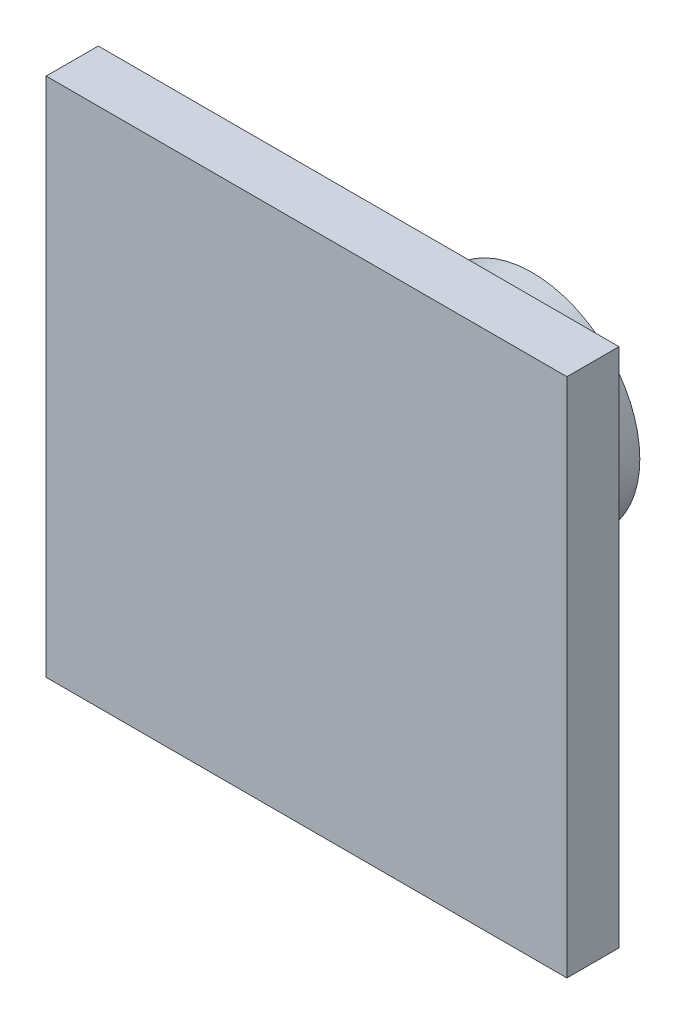
ISO-10303-21;
HEADER;
FILE_DESCRIPTION(('STEP AP214'),'2;1');
FILE_NAME('part.step','',(''),(''),'','','');
FILE_SCHEMA(('AUTOMOTIVE_DESIGN { 1 0 10303 214 1 1 1 1 }'));
ENDSEC;
DATA;
#1=APPLICATION_CONTEXT('core data for automotive mechanical design processes');
#2=APPLICATION_PROTOCOL_DEFINITION('international standard','automotive_design',2000,#1);
#3=PRODUCT_CONTEXT('',#1,'mechanical');
#4=PRODUCT('Part','Part','',(#3));
#5=PRODUCT_RELATED_PRODUCT_CATEGORY('part','',(#4));
#6=PRODUCT_DEFINITION_FORMATION('','',#4);
#7=PRODUCT_DEFINITION_CONTEXT('part definition',#1,'design');
#8=PRODUCT_DEFINITION('design','',#6,#7);
#9=PRODUCT_DEFINITION_SHAPE('','',#8);
#10=(LENGTH_UNIT() NAMED_UNIT(*) SI_UNIT(.MILLI.,.METRE.));
#11=(NAMED_UNIT(*) PLANE_ANGLE_UNIT() SI_UNIT($,.RADIAN.));
#12=(NAMED_UNIT(*) SI_UNIT($,.STERADIAN.) SOLID_ANGLE_UNIT());
#13=UNCERTAINTY_MEASURE_WITH_UNIT(LENGTH_MEASURE(1.E-05),#10,'distance_accuracy_value','');
#14=(GEOMETRIC_REPRESENTATION_CONTEXT(3) GLOBAL_UNCERTAINTY_ASSIGNED_CONTEXT((#13)) GLOBAL_UNIT_ASSIGNED_CONTEXT((#10,
#11,#12)) REPRESENTATION_CONTEXT('',''));
#15=CARTESIAN_POINT('',(0.,0.,0.));
#16=DIRECTION('',(0.,0.,1.));
#17=DIRECTION('',(1.,0.,0.));
#18=AXIS2_PLACEMENT_3D('',#15,#16,#17);
#19=CARTESIAN_POINT('',(7.5,-7.5,1.5));
#20=DIRECTION('',(-1.,0.,0.));
#21=DIRECTION('',(0.,0.,1.));
#22=AXIS2_PLACEMENT_3D('',#19,#20,#21);
#23=PLANE('',#22);
#24=DIRECTION('',(0.,1.,0.));
#25=VECTOR('',#24,1.);
#26=CARTESIAN_POINT('',(7.5,-7.5,0.));
#27=LINE('',#26,#25);
#28=CARTESIAN_POINT('',(7.5,-7.5,0.));
#29=VERTEX_POINT('',#28);
#30=CARTESIAN_POINT('',(7.5,7.5,0.));
#31=VERTEX_POINT('',#30);
#32=EDGE_CURVE('E103',#29,#31,#27,.T.);
#33=ORIENTED_EDGE('',*,*,#32,.T.);
#34=DIRECTION('',(0.,0.,-1.));
#35=VECTOR('',#34,1.);
#36=CARTESIAN_POINT('',(7.5,7.5,1.5));
#37=LINE('',#36,#35);
#38=CARTESIAN_POINT('',(7.5,7.5,1.5));
#39=VERTEX_POINT('',#38);
#40=EDGE_CURVE('E94',#39,#31,#37,.T.);
#41=ORIENTED_EDGE('',*,*,#40,.F.);
#42=DIRECTION('',(0.,1.,0.));
#43=VECTOR('',#42,1.);
#44=CARTESIAN_POINT('',(7.5,-7.5,1.5));
#45=LINE('',#44,#43);
#46=CARTESIAN_POINT('',(7.5,-7.5,1.5));
#47=VERTEX_POINT('',#46);
#48=EDGE_CURVE('E88',#47,#39,#45,.T.);
#49=ORIENTED_EDGE('',*,*,#48,.F.);
#50=DIRECTION('',(0.,0.,-1.));
#51=VECTOR('',#50,1.);
#52=CARTESIAN_POINT('',(7.5,-7.5,1.5));
#53=LINE('',#52,#51);
#54=EDGE_CURVE('E99',#47,#29,#53,.T.);
#55=ORIENTED_EDGE('',*,*,#54,.T.);
#56=EDGE_LOOP('',(#33,#41,#49,#55));
#57=FACE_BOUND('',#56,.T.);
#58=ADVANCED_FACE('F35',(#57),#23,.F.);
#59=CARTESIAN_POINT('',(-7.5,7.5,1.5));
#60=DIRECTION('',(0.,-1.,0.));
#61=DIRECTION('',(0.,0.,-1.));
#62=AXIS2_PLACEMENT_3D('',#59,#60,#61);
#63=PLANE('',#62);
#64=DIRECTION('',(-1.,0.,0.));
#65=VECTOR('',#64,1.);
#66=CARTESIAN_POINT('',(-7.5,7.5,0.));
#67=LINE('',#66,#65);
#68=CARTESIAN_POINT('',(-7.5,7.5,0.));
#69=VERTEX_POINT('',#68);
#70=EDGE_CURVE('E93',#31,#69,#67,.T.);
#71=ORIENTED_EDGE('',*,*,#70,.T.);
#72=DIRECTION('',(0.,0.,-1.));
#73=VECTOR('',#72,1.);
#74=CARTESIAN_POINT('',(-7.5,7.5,1.5));
#75=LINE('',#74,#73);
#76=CARTESIAN_POINT('',(-7.5,7.5,1.5));
#77=VERTEX_POINT('',#76);
#78=EDGE_CURVE('E91',#77,#69,#75,.T.);
#79=ORIENTED_EDGE('',*,*,#78,.F.);
#80=DIRECTION('',(-1.,0.,0.));
#81=VECTOR('',#80,1.);
#82=CARTESIAN_POINT('',(-7.5,7.5,1.5));
#83=LINE('',#82,#81);
#84=EDGE_CURVE('E83',#39,#77,#83,.T.);
#85=ORIENTED_EDGE('',*,*,#84,.F.);
#86=ORIENTED_EDGE('',*,*,#40,.T.);
#87=EDGE_LOOP('',(#71,#79,#85,#86));
#88=FACE_BOUND('',#87,.T.);
#89=ADVANCED_FACE('F92',(#88),#63,.F.);
#90=CARTESIAN_POINT('',(-7.5,-7.5,1.5));
#91=DIRECTION('',(1.,0.,0.));
#92=DIRECTION('',(0.,0.,-1.));
#93=AXIS2_PLACEMENT_3D('',#90,#91,#92);
#94=PLANE('',#93);
#95=DIRECTION('',(0.,-1.,0.));
#96=VECTOR('',#95,1.);
#97=CARTESIAN_POINT('',(-7.5,-7.5,0.));
#98=LINE('',#97,#96);
#99=CARTESIAN_POINT('',(-7.5,-7.5,0.));
#100=VERTEX_POINT('',#99);
#101=EDGE_CURVE('E69',#69,#100,#98,.T.);
#102=ORIENTED_EDGE('',*,*,#101,.T.);
#103=DIRECTION('',(0.,0.,-1.));
#104=VECTOR('',#103,1.);
#105=CARTESIAN_POINT('',(-7.5,-7.5,1.5));
#106=LINE('',#105,#104);
#107=CARTESIAN_POINT('',(-7.5,-7.5,1.5));
#108=VERTEX_POINT('',#107);
#109=EDGE_CURVE('E95',#108,#100,#106,.T.);
#110=ORIENTED_EDGE('',*,*,#109,.F.);
#111=DIRECTION('',(0.,-1.,0.));
#112=VECTOR('',#111,1.);
#113=CARTESIAN_POINT('',(-7.5,-7.5,1.5));
#114=LINE('',#113,#112);
#115=EDGE_CURVE('E86',#77,#108,#114,.T.);
#116=ORIENTED_EDGE('',*,*,#115,.F.);
#117=ORIENTED_EDGE('',*,*,#78,.T.);
#118=EDGE_LOOP('',(#102,#110,#116,#117));
#119=FACE_BOUND('',#118,.T.);
#120=ADVANCED_FACE('F97',(#119),#94,.F.);
#121=CARTESIAN_POINT('',(-7.5,-7.5,1.5));
#122=DIRECTION('',(0.,1.,0.));
#123=DIRECTION('',(0.,0.,1.));
#124=AXIS2_PLACEMENT_3D('',#121,#122,#123);
#125=PLANE('',#124);
#126=DIRECTION('',(1.,0.,0.));
#127=VECTOR('',#126,1.);
#128=CARTESIAN_POINT('',(-7.5,-7.5,0.));
#129=LINE('',#128,#127);
#130=EDGE_CURVE('E75',#100,#29,#129,.T.);
#131=ORIENTED_EDGE('',*,*,#130,.T.);
#132=ORIENTED_EDGE('',*,*,#54,.F.);
#133=DIRECTION('',(1.,0.,0.));
#134=VECTOR('',#133,1.);
#135=CARTESIAN_POINT('',(-7.5,-7.5,1.5));
#136=LINE('',#135,#134);
#137=EDGE_CURVE('E52',#108,#47,#136,.T.);
#138=ORIENTED_EDGE('',*,*,#137,.F.);
#139=ORIENTED_EDGE('',*,*,#109,.T.);
#140=EDGE_LOOP('',(#131,#132,#138,#139));
#141=FACE_BOUND('',#140,.T.);
#142=ADVANCED_FACE('F154',(#141),#125,.F.);
#143=CARTESIAN_POINT('',(0.,0.,1.5));
#144=DIRECTION('',(0.,0.,-1.));
#145=DIRECTION('',(-1.,0.,0.));
#146=AXIS2_PLACEMENT_3D('',#143,#144,#145);
#147=PLANE('',#146);
#148=ORIENTED_EDGE('',*,*,#48,.T.);
#149=ORIENTED_EDGE('',*,*,#84,.T.);
#150=ORIENTED_EDGE('',*,*,#115,.T.);
#151=ORIENTED_EDGE('',*,*,#137,.T.);
#152=EDGE_LOOP('',(#148,#149,#150,#151));
#153=FACE_BOUND('',#152,.T.);
#154=ADVANCED_FACE('F84',(#153),#147,.F.);
#155=CARTESIAN_POINT('',(0.,0.,0.));
#156=DIRECTION('',(0.,0.,-1.));
#157=DIRECTION('',(-1.,0.,0.));
#158=AXIS2_PLACEMENT_3D('',#155,#156,#157);
#159=PLANE('',#158);
#160=CARTESIAN_POINT('',(0.,0.,0.));
#161=DIRECTION('',(0.,0.,-1.));
#162=DIRECTION('',(-1.,0.,0.));
#163=AXIS2_PLACEMENT_3D('',#160,#161,#162);
#164=CIRCLE('',#163,5.10000000000002);
#165=CARTESIAN_POINT('',(-5.10000000000002,0.,0.));
#166=VERTEX_POINT('',#165);
#167=EDGE_CURVE('E44',#166,#166,#164,.F.);
#168=ORIENTED_EDGE('',*,*,#167,.T.);
#169=EDGE_LOOP('',(#168));
#170=FACE_BOUND('',#169,.T.);
#171=ORIENTED_EDGE('',*,*,#32,.F.);
#172=ORIENTED_EDGE('',*,*,#130,.F.);
#173=ORIENTED_EDGE('',*,*,#101,.F.);
#174=ORIENTED_EDGE('',*,*,#70,.F.);
#175=EDGE_LOOP('',(#171,#172,#173,#174));
#176=FACE_BOUND('',#175,.T.);
#177=ADVANCED_FACE('F142',(#170,#176),#159,.T.);
#178=CARTESIAN_POINT('',(0.,0.,-5.));
#179=DIRECTION('',(0.,0.,1.));
#180=DIRECTION('',(1.,0.,0.));
#181=AXIS2_PLACEMENT_3D('',#178,#179,#180);
#182=CYLINDRICAL_SURFACE('',#181,3.1);
#183=CARTESIAN_POINT('',(0.,0.,-2.));
#184=DIRECTION('',(0.,0.,-1.));
#185=DIRECTION('',(-1.,0.,0.));
#186=AXIS2_PLACEMENT_3D('',#183,#184,#185);
#187=CIRCLE('',#186,3.1);
#188=CARTESIAN_POINT('',(-3.1,0.,-2.));
#189=VERTEX_POINT('',#188);
#190=EDGE_CURVE('E11',#189,#189,#187,.T.);
#191=ORIENTED_EDGE('',*,*,#190,.T.);
#192=EDGE_LOOP('',(#191));
#193=FACE_BOUND('',#192,.T.);
#194=CARTESIAN_POINT('',(0.,0.,-5.));
#195=DIRECTION('',(0.,0.,1.));
#196=DIRECTION('',(1.,0.,0.));
#197=AXIS2_PLACEMENT_3D('',#194,#195,#196);
#198=CIRCLE('',#197,3.1);
#199=CARTESIAN_POINT('',(3.1,0.,-5.));
#200=VERTEX_POINT('',#199);
#201=EDGE_CURVE('E106',#200,#200,#198,.T.);
#202=ORIENTED_EDGE('',*,*,#201,.T.);
#203=EDGE_LOOP('',(#202));
#204=FACE_BOUND('',#203,.T.);
#205=ADVANCED_FACE('F143',(#193,#204),#182,.T.);
#206=CARTESIAN_POINT('',(0.,0.,-5.));
#207=DIRECTION('',(0.,0.,1.));
#208=DIRECTION('',(1.,0.,0.));
#209=AXIS2_PLACEMENT_3D('',#206,#207,#208);
#210=PLANE('',#209);
#211=CARTESIAN_POINT('',(0.,0.,-5.));
#212=DIRECTION('',(0.,0.,1.));
#213=DIRECTION('',(1.,0.,0.));
#214=AXIS2_PLACEMENT_3D('',#211,#212,#213);
#215=CIRCLE('',#214,1.1);
#216=CARTESIAN_POINT('',(1.1,0.,-5.));
#217=VERTEX_POINT('',#216);
#218=EDGE_CURVE('E122',#217,#217,#215,.T.);
#219=ORIENTED_EDGE('',*,*,#218,.T.);
#220=EDGE_LOOP('',(#219));
#221=FACE_BOUND('',#220,.T.);
#222=ORIENTED_EDGE('',*,*,#201,.F.);
#223=EDGE_LOOP('',(#222));
#224=FACE_BOUND('',#223,.T.);
#225=ADVANCED_FACE('F129',(#221,#224),#210,.F.);
#226=CARTESIAN_POINT('',(0.,0.,-5.));
#227=DIRECTION('',(0.,0.,1.));
#228=DIRECTION('',(1.,0.,0.));
#229=AXIS2_PLACEMENT_3D('',#226,#227,#228);
#230=CYLINDRICAL_SURFACE('',#229,1.1);
#231=ORIENTED_EDGE('',*,*,#218,.F.);
#232=EDGE_LOOP('',(#231));
#233=FACE_BOUND('',#232,.T.);
#234=CARTESIAN_POINT('',(0.,0.,0.));
#235=DIRECTION('',(0.,0.,1.));
#236=DIRECTION('',(1.,0.,0.));
#237=AXIS2_PLACEMENT_3D('',#234,#235,#236);
#238=CIRCLE('',#237,1.1);
#239=CARTESIAN_POINT('',(1.1,0.,0.));
#240=VERTEX_POINT('',#239);
#241=EDGE_CURVE('E112',#240,#240,#238,.T.);
#242=ORIENTED_EDGE('',*,*,#241,.T.);
#243=EDGE_LOOP('',(#242));
#244=FACE_BOUND('',#243,.T.);
#245=ADVANCED_FACE('F132',(#233,#244),#230,.F.);
#246=ORIENTED_EDGE('',*,*,#241,.F.);
#247=EDGE_LOOP('',(#246));
#248=FACE_BOUND('',#247,.T.);
#249=ADVANCED_FACE('F134',(#248),#159,.T.);
#250=CARTESIAN_POINT('',(0.,0.,0.));
#251=DIRECTION('',(0.,0.,1.));
#252=DIRECTION('',(1.,0.,0.));
#253=AXIS2_PLACEMENT_3D('',#250,#251,#252);
#254=CONICAL_SURFACE('',#253,5.10000000000002,0.785398163397454);
#255=ORIENTED_EDGE('',*,*,#190,.F.);
#256=EDGE_LOOP('',(#255));
#257=FACE_BOUND('',#256,.T.);
#258=ORIENTED_EDGE('',*,*,#167,.F.);
#259=EDGE_LOOP('',(#258));
#260=FACE_BOUND('',#259,.T.);
#261=ADVANCED_FACE('F37',(#257,#260),#254,.T.);
#262=CLOSED_SHELL('',(#58,#89,#120,#142,#154,#177,#205,#225,#245,#249,#261));
#263=MANIFOLD_SOLID_BREP('B2',#262);
#264=ADVANCED_BREP_SHAPE_REPRESENTATION('',(#18,#263),#14);
#265=SHAPE_DEFINITION_REPRESENTATION(#9,#264);
ENDSEC;
END-ISO-10303-21;
